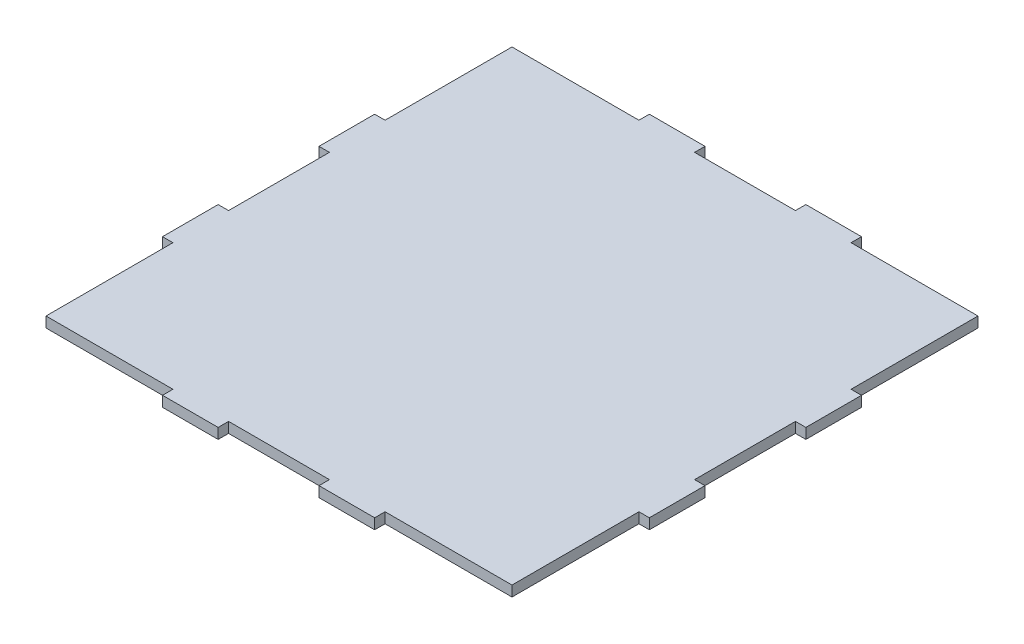
ISO-10303-21;
HEADER;
FILE_DESCRIPTION(('STEP AP214'),'2;1');
FILE_NAME('part.step','',(''),(''),'','','');
FILE_SCHEMA(('AUTOMOTIVE_DESIGN { 1 0 10303 214 1 1 1 1 }'));
ENDSEC;
DATA;
#1=APPLICATION_CONTEXT('core data for automotive mechanical design processes');
#2=APPLICATION_PROTOCOL_DEFINITION('international standard','automotive_design',2000,#1);
#3=PRODUCT_CONTEXT('',#1,'mechanical');
#4=PRODUCT('Part','Part','',(#3));
#5=PRODUCT_RELATED_PRODUCT_CATEGORY('part','',(#4));
#6=PRODUCT_DEFINITION_FORMATION('','',#4);
#7=PRODUCT_DEFINITION_CONTEXT('part definition',#1,'design');
#8=PRODUCT_DEFINITION('design','',#6,#7);
#9=PRODUCT_DEFINITION_SHAPE('','',#8);
#10=(LENGTH_UNIT() NAMED_UNIT(*) SI_UNIT(.MILLI.,.METRE.));
#11=(NAMED_UNIT(*) PLANE_ANGLE_UNIT() SI_UNIT($,.RADIAN.));
#12=(NAMED_UNIT(*) SI_UNIT($,.STERADIAN.) SOLID_ANGLE_UNIT());
#13=UNCERTAINTY_MEASURE_WITH_UNIT(LENGTH_MEASURE(1.E-05),#10,'distance_accuracy_value','');
#14=(GEOMETRIC_REPRESENTATION_CONTEXT(3) GLOBAL_UNCERTAINTY_ASSIGNED_CONTEXT((#13)) GLOBAL_UNIT_ASSIGNED_CONTEXT((#10,
#11,#12)) REPRESENTATION_CONTEXT('',''));
#15=CARTESIAN_POINT('',(0.,0.,0.));
#16=DIRECTION('',(0.,0.,1.));
#17=DIRECTION('',(1.,0.,0.));
#18=AXIS2_PLACEMENT_3D('',#15,#16,#17);
#19=CARTESIAN_POINT('',(0.,3.,-70.));
#20=DIRECTION('',(0.,0.,-1.));
#21=DIRECTION('',(-1.,0.,0.));
#22=AXIS2_PLACEMENT_3D('',#19,#20,#21);
#23=PLANE('',#22);
#24=DIRECTION('',(0.,1.,0.));
#25=VECTOR('',#24,1.);
#26=CARTESIAN_POINT('',(14.5,0.,-70.));
#27=LINE('',#26,#25);
#28=CARTESIAN_POINT('',(14.5,0.,-70.));
#29=VERTEX_POINT('',#28);
#30=CARTESIAN_POINT('',(14.5,3.,-70.));
#31=VERTEX_POINT('',#30);
#32=EDGE_CURVE('E512',#29,#31,#27,.T.);
#33=ORIENTED_EDGE('',*,*,#32,.T.);
#34=DIRECTION('',(1.,0.,0.));
#35=VECTOR('',#34,1.);
#36=CARTESIAN_POINT('',(0.,3.,-70.));
#37=LINE('',#36,#35);
#38=CARTESIAN_POINT('',(30.5,3.,-70.));
#39=VERTEX_POINT('',#38);
#40=EDGE_CURVE('E704',#31,#39,#37,.T.);
#41=ORIENTED_EDGE('',*,*,#40,.T.);
#42=DIRECTION('',(0.,1.,0.));
#43=VECTOR('',#42,1.);
#44=CARTESIAN_POINT('',(30.5,0.,-70.));
#45=LINE('',#44,#43);
#46=CARTESIAN_POINT('',(30.5,0.,-70.));
#47=VERTEX_POINT('',#46);
#48=EDGE_CURVE('E624',#47,#39,#45,.T.);
#49=ORIENTED_EDGE('',*,*,#48,.F.);
#50=DIRECTION('',(1.,0.,0.));
#51=VECTOR('',#50,1.);
#52=CARTESIAN_POINT('',(0.,0.,-70.));
#53=LINE('',#52,#51);
#54=EDGE_CURVE('E703',#29,#47,#53,.T.);
#55=ORIENTED_EDGE('',*,*,#54,.F.);
#56=EDGE_LOOP('',(#33,#41,#49,#55));
#57=FACE_BOUND('',#56,.T.);
#58=ADVANCED_FACE('F137',(#57),#23,.T.);
#59=DIRECTION('',(0.,1.,0.));
#60=VECTOR('',#59,1.);
#61=CARTESIAN_POINT('',(-14.5,0.,-70.));
#62=LINE('',#61,#60);
#63=CARTESIAN_POINT('',(-14.5,0.,-70.));
#64=VERTEX_POINT('',#63);
#65=CARTESIAN_POINT('',(-14.5,3.,-70.));
#66=VERTEX_POINT('',#65);
#67=EDGE_CURVE('E516',#64,#66,#62,.T.);
#68=ORIENTED_EDGE('',*,*,#67,.F.);
#69=CARTESIAN_POINT('',(-30.5,0.,-70.));
#70=VERTEX_POINT('',#69);
#71=EDGE_CURVE('E724',#70,#64,#53,.T.);
#72=ORIENTED_EDGE('',*,*,#71,.F.);
#73=DIRECTION('',(0.,1.,0.));
#74=VECTOR('',#73,1.);
#75=CARTESIAN_POINT('',(-30.5,0.,-70.));
#76=LINE('',#75,#74);
#77=CARTESIAN_POINT('',(-30.5,3.,-70.));
#78=VERTEX_POINT('',#77);
#79=EDGE_CURVE('E469',#70,#78,#76,.T.);
#80=ORIENTED_EDGE('',*,*,#79,.T.);
#81=EDGE_CURVE('E708',#78,#66,#37,.T.);
#82=ORIENTED_EDGE('',*,*,#81,.T.);
#83=EDGE_LOOP('',(#68,#72,#80,#82));
#84=FACE_BOUND('',#83,.T.);
#85=ADVANCED_FACE('F832',(#84),#23,.T.);
#86=CARTESIAN_POINT('',(-70.,3.,0.));
#87=DIRECTION('',(1.,0.,0.));
#88=DIRECTION('',(0.,0.,-1.));
#89=AXIS2_PLACEMENT_3D('',#86,#87,#88);
#90=PLANE('',#89);
#91=DIRECTION('',(0.,1.,0.));
#92=VECTOR('',#91,1.);
#93=CARTESIAN_POINT('',(-70.,0.,14.5));
#94=LINE('',#93,#92);
#95=CARTESIAN_POINT('',(-70.,0.,14.5));
#96=VERTEX_POINT('',#95);
#97=CARTESIAN_POINT('',(-70.,3.,14.5));
#98=VERTEX_POINT('',#97);
#99=EDGE_CURVE('E430',#96,#98,#94,.T.);
#100=ORIENTED_EDGE('',*,*,#99,.F.);
#101=DIRECTION('',(0.,0.,1.));
#102=VECTOR('',#101,1.);
#103=CARTESIAN_POINT('',(-70.,0.,0.));
#104=LINE('',#103,#102);
#105=CARTESIAN_POINT('',(-70.,0.,30.5));
#106=VERTEX_POINT('',#105);
#107=EDGE_CURVE('E725',#96,#106,#104,.T.);
#108=ORIENTED_EDGE('',*,*,#107,.T.);
#109=DIRECTION('',(0.,1.,0.));
#110=VECTOR('',#109,1.);
#111=CARTESIAN_POINT('',(-70.,0.,30.5));
#112=LINE('',#111,#110);
#113=CARTESIAN_POINT('',(-70.,3.,30.5));
#114=VERTEX_POINT('',#113);
#115=EDGE_CURVE('E678',#106,#114,#112,.T.);
#116=ORIENTED_EDGE('',*,*,#115,.T.);
#117=DIRECTION('',(0.,0.,1.));
#118=VECTOR('',#117,1.);
#119=CARTESIAN_POINT('',(-70.,3.,0.));
#120=LINE('',#119,#118);
#121=EDGE_CURVE('E710',#98,#114,#120,.T.);
#122=ORIENTED_EDGE('',*,*,#121,.F.);
#123=EDGE_LOOP('',(#100,#108,#116,#122));
#124=FACE_BOUND('',#123,.T.);
#125=ADVANCED_FACE('F815',(#124),#90,.F.);
#126=DIRECTION('',(0.,1.,0.));
#127=VECTOR('',#126,1.);
#128=CARTESIAN_POINT('',(-70.,0.,-14.5));
#129=LINE('',#128,#127);
#130=CARTESIAN_POINT('',(-70.,0.,-14.5));
#131=VERTEX_POINT('',#130);
#132=CARTESIAN_POINT('',(-70.,3.,-14.5));
#133=VERTEX_POINT('',#132);
#134=EDGE_CURVE('E433',#131,#133,#129,.T.);
#135=ORIENTED_EDGE('',*,*,#134,.T.);
#136=CARTESIAN_POINT('',(-70.,3.,-30.5));
#137=VERTEX_POINT('',#136);
#138=EDGE_CURVE('E714',#137,#133,#120,.T.);
#139=ORIENTED_EDGE('',*,*,#138,.F.);
#140=DIRECTION('',(0.,1.,0.));
#141=VECTOR('',#140,1.);
#142=CARTESIAN_POINT('',(-70.,0.,-30.5));
#143=LINE('',#142,#141);
#144=CARTESIAN_POINT('',(-70.,0.,-30.5));
#145=VERTEX_POINT('',#144);
#146=EDGE_CURVE('E470',#145,#137,#143,.T.);
#147=ORIENTED_EDGE('',*,*,#146,.F.);
#148=EDGE_CURVE('E728',#145,#131,#104,.T.);
#149=ORIENTED_EDGE('',*,*,#148,.T.);
#150=EDGE_LOOP('',(#135,#139,#147,#149));
#151=FACE_BOUND('',#150,.T.);
#152=ADVANCED_FACE('F743',(#151),#90,.F.);
#153=CARTESIAN_POINT('',(0.,3.,70.));
#154=DIRECTION('',(0.,0.,-1.));
#155=DIRECTION('',(-1.,0.,0.));
#156=AXIS2_PLACEMENT_3D('',#153,#154,#155);
#157=PLANE('',#156);
#158=DIRECTION('',(0.,1.,0.));
#159=VECTOR('',#158,1.);
#160=CARTESIAN_POINT('',(-14.5,0.,70.));
#161=LINE('',#160,#159);
#162=CARTESIAN_POINT('',(-14.5,0.,70.));
#163=VERTEX_POINT('',#162);
#164=CARTESIAN_POINT('',(-14.5,3.,70.));
#165=VERTEX_POINT('',#164);
#166=EDGE_CURVE('E591',#163,#165,#161,.T.);
#167=ORIENTED_EDGE('',*,*,#166,.T.);
#168=DIRECTION('',(1.,0.,0.));
#169=VECTOR('',#168,1.);
#170=CARTESIAN_POINT('',(0.,3.,70.));
#171=LINE('',#170,#169);
#172=CARTESIAN_POINT('',(-30.5,3.,70.));
#173=VERTEX_POINT('',#172);
#174=EDGE_CURVE('E718',#173,#165,#171,.T.);
#175=ORIENTED_EDGE('',*,*,#174,.F.);
#176=DIRECTION('',(0.,1.,0.));
#177=VECTOR('',#176,1.);
#178=CARTESIAN_POINT('',(-30.5,0.,70.));
#179=LINE('',#178,#177);
#180=CARTESIAN_POINT('',(-30.5,0.,70.));
#181=VERTEX_POINT('',#180);
#182=EDGE_CURVE('E690',#181,#173,#179,.T.);
#183=ORIENTED_EDGE('',*,*,#182,.F.);
#184=DIRECTION('',(1.,0.,0.));
#185=VECTOR('',#184,1.);
#186=CARTESIAN_POINT('',(0.,0.,70.));
#187=LINE('',#186,#185);
#188=EDGE_CURVE('E732',#181,#163,#187,.T.);
#189=ORIENTED_EDGE('',*,*,#188,.T.);
#190=EDGE_LOOP('',(#167,#175,#183,#189));
#191=FACE_BOUND('',#190,.T.);
#192=ADVANCED_FACE('F795',(#191),#157,.F.);
#193=DIRECTION('',(0.,1.,0.));
#194=VECTOR('',#193,1.);
#195=CARTESIAN_POINT('',(14.5,0.,70.));
#196=LINE('',#195,#194);
#197=CARTESIAN_POINT('',(14.5,0.,70.));
#198=VERTEX_POINT('',#197);
#199=CARTESIAN_POINT('',(14.5,3.,70.));
#200=VERTEX_POINT('',#199);
#201=EDGE_CURVE('E588',#198,#200,#196,.T.);
#202=ORIENTED_EDGE('',*,*,#201,.F.);
#203=CARTESIAN_POINT('',(30.5,0.,70.));
#204=VERTEX_POINT('',#203);
#205=EDGE_CURVE('E729',#198,#204,#187,.T.);
#206=ORIENTED_EDGE('',*,*,#205,.T.);
#207=DIRECTION('',(0.,1.,0.));
#208=VECTOR('',#207,1.);
#209=CARTESIAN_POINT('',(30.5,0.,70.));
#210=LINE('',#209,#208);
#211=CARTESIAN_POINT('',(30.5,3.,70.));
#212=VERTEX_POINT('',#211);
#213=EDGE_CURVE('E413',#204,#212,#210,.T.);
#214=ORIENTED_EDGE('',*,*,#213,.T.);
#215=EDGE_CURVE('E715',#200,#212,#171,.T.);
#216=ORIENTED_EDGE('',*,*,#215,.F.);
#217=EDGE_LOOP('',(#202,#206,#214,#216));
#218=FACE_BOUND('',#217,.T.);
#219=ADVANCED_FACE('F778',(#218),#157,.F.);
#220=CARTESIAN_POINT('',(70.,3.,0.));
#221=DIRECTION('',(1.,0.,0.));
#222=DIRECTION('',(0.,0.,-1.));
#223=AXIS2_PLACEMENT_3D('',#220,#221,#222);
#224=PLANE('',#223);
#225=DIRECTION('',(0.,1.,0.));
#226=VECTOR('',#225,1.);
#227=CARTESIAN_POINT('',(70.,0.,-14.5));
#228=LINE('',#227,#226);
#229=CARTESIAN_POINT('',(70.,0.,-14.5));
#230=VERTEX_POINT('',#229);
#231=CARTESIAN_POINT('',(70.,3.,-14.5));
#232=VERTEX_POINT('',#231);
#233=EDGE_CURVE('E394',#230,#232,#228,.T.);
#234=ORIENTED_EDGE('',*,*,#233,.F.);
#235=DIRECTION('',(0.,0.,1.));
#236=VECTOR('',#235,1.);
#237=CARTESIAN_POINT('',(70.,0.,0.));
#238=LINE('',#237,#236);
#239=CARTESIAN_POINT('',(70.,0.,-30.5));
#240=VERTEX_POINT('',#239);
#241=EDGE_CURVE('E709',#240,#230,#238,.T.);
#242=ORIENTED_EDGE('',*,*,#241,.F.);
#243=DIRECTION('',(0.,1.,0.));
#244=VECTOR('',#243,1.);
#245=CARTESIAN_POINT('',(70.,0.,-30.5));
#246=LINE('',#245,#244);
#247=CARTESIAN_POINT('',(70.,3.,-30.5));
#248=VERTEX_POINT('',#247);
#249=EDGE_CURVE('E620',#240,#248,#246,.T.);
#250=ORIENTED_EDGE('',*,*,#249,.T.);
#251=DIRECTION('',(0.,0.,1.));
#252=VECTOR('',#251,1.);
#253=CARTESIAN_POINT('',(70.,3.,0.));
#254=LINE('',#253,#252);
#255=EDGE_CURVE('E12',#248,#232,#254,.T.);
#256=ORIENTED_EDGE('',*,*,#255,.T.);
#257=EDGE_LOOP('',(#234,#242,#250,#256));
#258=FACE_BOUND('',#257,.T.);
#259=ADVANCED_FACE('F937',(#258),#224,.T.);
#260=DIRECTION('',(0.,1.,0.));
#261=VECTOR('',#260,1.);
#262=CARTESIAN_POINT('',(70.,0.,14.5));
#263=LINE('',#262,#261);
#264=CARTESIAN_POINT('',(70.,0.,14.5));
#265=VERTEX_POINT('',#264);
#266=CARTESIAN_POINT('',(70.,3.,14.5));
#267=VERTEX_POINT('',#266);
#268=EDGE_CURVE('E554',#265,#267,#263,.T.);
#269=ORIENTED_EDGE('',*,*,#268,.T.);
#270=CARTESIAN_POINT('',(70.,3.,30.5));
#271=VERTEX_POINT('',#270);
#272=EDGE_CURVE('E146',#267,#271,#254,.T.);
#273=ORIENTED_EDGE('',*,*,#272,.T.);
#274=DIRECTION('',(0.,1.,0.));
#275=VECTOR('',#274,1.);
#276=CARTESIAN_POINT('',(70.,0.,30.5));
#277=LINE('',#276,#275);
#278=CARTESIAN_POINT('',(70.,0.,30.5));
#279=VERTEX_POINT('',#278);
#280=EDGE_CURVE('E383',#279,#271,#277,.T.);
#281=ORIENTED_EDGE('',*,*,#280,.F.);
#282=EDGE_CURVE('E140',#265,#279,#238,.T.);
#283=ORIENTED_EDGE('',*,*,#282,.F.);
#284=EDGE_LOOP('',(#269,#273,#281,#283));
#285=FACE_BOUND('',#284,.T.);
#286=ADVANCED_FACE('F766',(#285),#224,.T.);
#287=CARTESIAN_POINT('',(0.,3.,0.));
#288=DIRECTION('',(0.,1.,0.));
#289=DIRECTION('',(0.,0.,1.));
#290=AXIS2_PLACEMENT_3D('',#287,#288,#289);
#291=PLANE('',#290);
#292=DIRECTION('',(-1.,0.,0.));
#293=VECTOR('',#292,1.);
#294=CARTESIAN_POINT('',(70.,3.,-14.5));
#295=LINE('',#294,#293);
#296=CARTESIAN_POINT('',(67.,3.,-14.5));
#297=VERTEX_POINT('',#296);
#298=EDGE_CURVE('E525',#232,#297,#295,.T.);
#299=ORIENTED_EDGE('',*,*,#298,.F.);
#300=ORIENTED_EDGE('',*,*,#255,.F.);
#301=DIRECTION('',(-1.,0.,0.));
#302=VECTOR('',#301,1.);
#303=CARTESIAN_POINT('',(70.,3.,-30.5));
#304=LINE('',#303,#302);
#305=CARTESIAN_POINT('',(67.,3.,-30.5));
#306=VERTEX_POINT('',#305);
#307=EDGE_CURVE('E625',#248,#306,#304,.T.);
#308=ORIENTED_EDGE('',*,*,#307,.T.);
#309=DIRECTION('',(0.,0.,-1.));
#310=VECTOR('',#309,1.);
#311=CARTESIAN_POINT('',(67.,3.,-30.5));
#312=LINE('',#311,#310);
#313=CARTESIAN_POINT('',(67.,3.,-67.));
#314=VERTEX_POINT('',#313);
#315=EDGE_CURVE('E648',#306,#314,#312,.T.);
#316=ORIENTED_EDGE('',*,*,#315,.T.);
#317=DIRECTION('',(-1.,0.,0.));
#318=VECTOR('',#317,1.);
#319=CARTESIAN_POINT('',(70.,3.,-67.));
#320=LINE('',#319,#318);
#321=CARTESIAN_POINT('',(30.5,3.,-67.));
#322=VERTEX_POINT('',#321);
#323=EDGE_CURVE('E585',#314,#322,#320,.T.);
#324=ORIENTED_EDGE('',*,*,#323,.T.);
#325=DIRECTION('',(0.,0.,-1.));
#326=VECTOR('',#325,1.);
#327=CARTESIAN_POINT('',(30.5,3.,-67.));
#328=LINE('',#327,#326);
#329=EDGE_CURVE('E629',#322,#39,#328,.T.);
#330=ORIENTED_EDGE('',*,*,#329,.T.);
#331=ORIENTED_EDGE('',*,*,#40,.F.);
#332=DIRECTION('',(0.,0.,-1.));
#333=VECTOR('',#332,1.);
#334=CARTESIAN_POINT('',(14.5,3.,-67.));
#335=LINE('',#334,#333);
#336=CARTESIAN_POINT('',(14.5,3.,-67.));
#337=VERTEX_POINT('',#336);
#338=EDGE_CURVE('E535',#337,#31,#335,.T.);
#339=ORIENTED_EDGE('',*,*,#338,.F.);
#340=DIRECTION('',(1.,0.,0.));
#341=VECTOR('',#340,1.);
#342=CARTESIAN_POINT('',(-14.5,3.,-67.));
#343=LINE('',#342,#341);
#344=CARTESIAN_POINT('',(-14.5,3.,-67.));
#345=VERTEX_POINT('',#344);
#346=EDGE_CURVE('E526',#345,#337,#343,.T.);
#347=ORIENTED_EDGE('',*,*,#346,.F.);
#348=DIRECTION('',(0.,0.,1.));
#349=VECTOR('',#348,1.);
#350=CARTESIAN_POINT('',(-14.5,3.,-70.));
#351=LINE('',#350,#349);
#352=EDGE_CURVE('E530',#66,#345,#351,.T.);
#353=ORIENTED_EDGE('',*,*,#352,.F.);
#354=ORIENTED_EDGE('',*,*,#81,.F.);
#355=DIRECTION('',(0.,0.,-1.));
#356=VECTOR('',#355,1.);
#357=CARTESIAN_POINT('',(-30.5,3.,-67.));
#358=LINE('',#357,#356);
#359=CARTESIAN_POINT('',(-30.5,3.,-67.));
#360=VERTEX_POINT('',#359);
#361=EDGE_CURVE('E500',#360,#78,#358,.T.);
#362=ORIENTED_EDGE('',*,*,#361,.F.);
#363=DIRECTION('',(1.,0.,0.));
#364=VECTOR('',#363,1.);
#365=CARTESIAN_POINT('',(-70.,3.,-67.));
#366=LINE('',#365,#364);
#367=CARTESIAN_POINT('',(-67.,3.,-67.));
#368=VERTEX_POINT('',#367);
#369=EDGE_CURVE('E477',#368,#360,#366,.T.);
#370=ORIENTED_EDGE('',*,*,#369,.F.);
#371=DIRECTION('',(0.,0.,-1.));
#372=VECTOR('',#371,1.);
#373=CARTESIAN_POINT('',(-67.,3.,-30.5));
#374=LINE('',#373,#372);
#375=CARTESIAN_POINT('',(-67.,3.,-30.5));
#376=VERTEX_POINT('',#375);
#377=EDGE_CURVE('E478',#376,#368,#374,.T.);
#378=ORIENTED_EDGE('',*,*,#377,.F.);
#379=DIRECTION('',(1.,0.,0.));
#380=VECTOR('',#379,1.);
#381=CARTESIAN_POINT('',(-70.,3.,-30.5));
#382=LINE('',#381,#380);
#383=EDGE_CURVE('E434',#137,#376,#382,.T.);
#384=ORIENTED_EDGE('',*,*,#383,.F.);
#385=ORIENTED_EDGE('',*,*,#138,.T.);
#386=DIRECTION('',(1.,0.,0.));
#387=VECTOR('',#386,1.);
#388=CARTESIAN_POINT('',(-70.,3.,-14.5));
#389=LINE('',#388,#387);
#390=CARTESIAN_POINT('',(-67.,3.,-14.5));
#391=VERTEX_POINT('',#390);
#392=EDGE_CURVE('E449',#133,#391,#389,.T.);
#393=ORIENTED_EDGE('',*,*,#392,.T.);
#394=DIRECTION('',(0.,0.,1.));
#395=VECTOR('',#394,1.);
#396=CARTESIAN_POINT('',(-67.,3.,-14.5));
#397=LINE('',#396,#395);
#398=CARTESIAN_POINT('',(-67.,3.,14.5));
#399=VERTEX_POINT('',#398);
#400=EDGE_CURVE('E445',#391,#399,#397,.T.);
#401=ORIENTED_EDGE('',*,*,#400,.T.);
#402=DIRECTION('',(-1.,0.,0.));
#403=VECTOR('',#402,1.);
#404=CARTESIAN_POINT('',(-67.,3.,14.5));
#405=LINE('',#404,#403);
#406=EDGE_CURVE('E454',#399,#98,#405,.T.);
#407=ORIENTED_EDGE('',*,*,#406,.T.);
#408=ORIENTED_EDGE('',*,*,#121,.T.);
#409=DIRECTION('',(1.,0.,0.));
#410=VECTOR('',#409,1.);
#411=CARTESIAN_POINT('',(-70.,3.,30.5));
#412=LINE('',#411,#410);
#413=CARTESIAN_POINT('',(-67.,3.,30.5));
#414=VERTEX_POINT('',#413);
#415=EDGE_CURVE('E668',#114,#414,#412,.T.);
#416=ORIENTED_EDGE('',*,*,#415,.T.);
#417=DIRECTION('',(0.,0.,1.));
#418=VECTOR('',#417,1.);
#419=CARTESIAN_POINT('',(-67.,3.,30.5));
#420=LINE('',#419,#418);
#421=CARTESIAN_POINT('',(-67.,3.,67.));
#422=VERTEX_POINT('',#421);
#423=EDGE_CURVE('E664',#414,#422,#420,.T.);
#424=ORIENTED_EDGE('',*,*,#423,.T.);
#425=DIRECTION('',(1.,0.,0.));
#426=VECTOR('',#425,1.);
#427=CARTESIAN_POINT('',(-70.,3.,67.));
#428=LINE('',#427,#426);
#429=CARTESIAN_POINT('',(-30.5,3.,67.));
#430=VERTEX_POINT('',#429);
#431=EDGE_CURVE('E609',#422,#430,#428,.T.);
#432=ORIENTED_EDGE('',*,*,#431,.T.);
#433=DIRECTION('',(0.,0.,1.));
#434=VECTOR('',#433,1.);
#435=CARTESIAN_POINT('',(-30.5,3.,67.));
#436=LINE('',#435,#434);
#437=EDGE_CURVE('E687',#430,#173,#436,.T.);
#438=ORIENTED_EDGE('',*,*,#437,.T.);
#439=ORIENTED_EDGE('',*,*,#174,.T.);
#440=DIRECTION('',(0.,0.,-1.));
#441=VECTOR('',#440,1.);
#442=CARTESIAN_POINT('',(-14.5,3.,70.));
#443=LINE('',#442,#441);
#444=CARTESIAN_POINT('',(-14.5,3.,67.));
#445=VERTEX_POINT('',#444);
#446=EDGE_CURVE('E605',#165,#445,#443,.T.);
#447=ORIENTED_EDGE('',*,*,#446,.T.);
#448=DIRECTION('',(1.,0.,0.));
#449=VECTOR('',#448,1.);
#450=CARTESIAN_POINT('',(-14.5,3.,67.));
#451=LINE('',#450,#449);
#452=CARTESIAN_POINT('',(14.5,3.,67.));
#453=VERTEX_POINT('',#452);
#454=EDGE_CURVE('E600',#445,#453,#451,.T.);
#455=ORIENTED_EDGE('',*,*,#454,.T.);
#456=DIRECTION('',(0.,0.,1.));
#457=VECTOR('',#456,1.);
#458=CARTESIAN_POINT('',(14.5,3.,67.));
#459=LINE('',#458,#457);
#460=EDGE_CURVE('E596',#453,#200,#459,.T.);
#461=ORIENTED_EDGE('',*,*,#460,.T.);
#462=ORIENTED_EDGE('',*,*,#215,.T.);
#463=DIRECTION('',(0.,0.,1.));
#464=VECTOR('',#463,1.);
#465=CARTESIAN_POINT('',(30.5,3.,67.));
#466=LINE('',#465,#464);
#467=CARTESIAN_POINT('',(30.5,3.,67.));
#468=VERTEX_POINT('',#467);
#469=EDGE_CURVE('E418',#468,#212,#466,.T.);
#470=ORIENTED_EDGE('',*,*,#469,.F.);
#471=DIRECTION('',(-1.,0.,0.));
#472=VECTOR('',#471,1.);
#473=CARTESIAN_POINT('',(70.,3.,67.));
#474=LINE('',#473,#472);
#475=CARTESIAN_POINT('',(67.,3.,67.));
#476=VERTEX_POINT('',#475);
#477=EDGE_CURVE('E384',#476,#468,#474,.T.);
#478=ORIENTED_EDGE('',*,*,#477,.F.);
#479=DIRECTION('',(0.,0.,1.));
#480=VECTOR('',#479,1.);
#481=CARTESIAN_POINT('',(67.,3.,30.5));
#482=LINE('',#481,#480);
#483=CARTESIAN_POINT('',(67.,3.,30.5));
#484=VERTEX_POINT('',#483);
#485=EDGE_CURVE('E376',#484,#476,#482,.T.);
#486=ORIENTED_EDGE('',*,*,#485,.F.);
#487=DIRECTION('',(-1.,0.,0.));
#488=VECTOR('',#487,1.);
#489=CARTESIAN_POINT('',(70.,3.,30.5));
#490=LINE('',#489,#488);
#491=EDGE_CURVE('E387',#271,#484,#490,.T.);
#492=ORIENTED_EDGE('',*,*,#491,.F.);
#493=ORIENTED_EDGE('',*,*,#272,.F.);
#494=DIRECTION('',(1.,0.,0.));
#495=VECTOR('',#494,1.);
#496=CARTESIAN_POINT('',(67.,3.,14.5));
#497=LINE('',#496,#495);
#498=CARTESIAN_POINT('',(67.,3.,14.5));
#499=VERTEX_POINT('',#498);
#500=EDGE_CURVE('E560',#499,#267,#497,.T.);
#501=ORIENTED_EDGE('',*,*,#500,.F.);
#502=DIRECTION('',(0.,0.,1.));
#503=VECTOR('',#502,1.);
#504=CARTESIAN_POINT('',(67.,3.,-14.5));
#505=LINE('',#504,#503);
#506=EDGE_CURVE('E563',#297,#499,#505,.T.);
#507=ORIENTED_EDGE('',*,*,#506,.F.);
#508=EDGE_LOOP('',(#299,#300,#308,#316,#324,#330,#331,#339,#347,#353,#354,#362,#370,#378,#384,
#385,#393,#401,#407,#408,#416,#424,#432,#438,#439,#447,#455,#461,#462,#470,#478,#486,#492,#493,
#501,#507));
#509=FACE_BOUND('',#508,.T.);
#510=ADVANCED_FACE('F397',(#509),#291,.T.);
#511=CARTESIAN_POINT('',(0.,0.,0.));
#512=DIRECTION('',(0.,1.,0.));
#513=DIRECTION('',(0.,0.,1.));
#514=AXIS2_PLACEMENT_3D('',#511,#512,#513);
#515=PLANE('',#514);
#516=ORIENTED_EDGE('',*,*,#241,.T.);
#517=DIRECTION('',(-1.,0.,0.));
#518=VECTOR('',#517,1.);
#519=CARTESIAN_POINT('',(70.,0.,-14.5));
#520=LINE('',#519,#518);
#521=CARTESIAN_POINT('',(67.,0.,-14.5));
#522=VERTEX_POINT('',#521);
#523=EDGE_CURVE('E564',#230,#522,#520,.T.);
#524=ORIENTED_EDGE('',*,*,#523,.T.);
#525=DIRECTION('',(0.,0.,1.));
#526=VECTOR('',#525,1.);
#527=CARTESIAN_POINT('',(67.,0.,-14.5));
#528=LINE('',#527,#526);
#529=CARTESIAN_POINT('',(67.,0.,14.5));
#530=VERTEX_POINT('',#529);
#531=EDGE_CURVE('E573',#522,#530,#528,.T.);
#532=ORIENTED_EDGE('',*,*,#531,.T.);
#533=DIRECTION('',(1.,0.,0.));
#534=VECTOR('',#533,1.);
#535=CARTESIAN_POINT('',(67.,0.,14.5));
#536=LINE('',#535,#534);
#537=EDGE_CURVE('E154',#530,#265,#536,.T.);
#538=ORIENTED_EDGE('',*,*,#537,.T.);
#539=ORIENTED_EDGE('',*,*,#282,.T.);
#540=DIRECTION('',(-1.,0.,0.));
#541=VECTOR('',#540,1.);
#542=CARTESIAN_POINT('',(70.,0.,30.5));
#543=LINE('',#542,#541);
#544=CARTESIAN_POINT('',(67.,0.,30.5));
#545=VERTEX_POINT('',#544);
#546=EDGE_CURVE('E400',#279,#545,#543,.T.);
#547=ORIENTED_EDGE('',*,*,#546,.T.);
#548=DIRECTION('',(0.,0.,1.));
#549=VECTOR('',#548,1.);
#550=CARTESIAN_POINT('',(67.,0.,30.5));
#551=LINE('',#550,#549);
#552=CARTESIAN_POINT('',(67.,0.,67.));
#553=VERTEX_POINT('',#552);
#554=EDGE_CURVE('E379',#545,#553,#551,.T.);
#555=ORIENTED_EDGE('',*,*,#554,.T.);
#556=DIRECTION('',(-1.,0.,0.));
#557=VECTOR('',#556,1.);
#558=CARTESIAN_POINT('',(70.,0.,67.));
#559=LINE('',#558,#557);
#560=CARTESIAN_POINT('',(30.5,0.,67.));
#561=VERTEX_POINT('',#560);
#562=EDGE_CURVE('E421',#553,#561,#559,.T.);
#563=ORIENTED_EDGE('',*,*,#562,.T.);
#564=DIRECTION('',(0.,0.,1.));
#565=VECTOR('',#564,1.);
#566=CARTESIAN_POINT('',(30.5,0.,67.));
#567=LINE('',#566,#565);
#568=EDGE_CURVE('E412',#561,#204,#567,.T.);
#569=ORIENTED_EDGE('',*,*,#568,.T.);
#570=ORIENTED_EDGE('',*,*,#205,.F.);
#571=DIRECTION('',(0.,0.,1.));
#572=VECTOR('',#571,1.);
#573=CARTESIAN_POINT('',(14.5,0.,67.));
#574=LINE('',#573,#572);
#575=CARTESIAN_POINT('',(14.5,0.,67.));
#576=VERTEX_POINT('',#575);
#577=EDGE_CURVE('E595',#576,#198,#574,.T.);
#578=ORIENTED_EDGE('',*,*,#577,.F.);
#579=DIRECTION('',(1.,0.,0.));
#580=VECTOR('',#579,1.);
#581=CARTESIAN_POINT('',(-14.5,0.,67.));
#582=LINE('',#581,#580);
#583=CARTESIAN_POINT('',(-14.5,0.,67.));
#584=VERTEX_POINT('',#583);
#585=EDGE_CURVE('E612',#584,#576,#582,.T.);
#586=ORIENTED_EDGE('',*,*,#585,.F.);
#587=DIRECTION('',(0.,0.,-1.));
#588=VECTOR('',#587,1.);
#589=CARTESIAN_POINT('',(-14.5,0.,70.));
#590=LINE('',#589,#588);
#591=EDGE_CURVE('E601',#163,#584,#590,.T.);
#592=ORIENTED_EDGE('',*,*,#591,.F.);
#593=ORIENTED_EDGE('',*,*,#188,.F.);
#594=DIRECTION('',(0.,0.,1.));
#595=VECTOR('',#594,1.);
#596=CARTESIAN_POINT('',(-30.5,0.,67.));
#597=LINE('',#596,#595);
#598=CARTESIAN_POINT('',(-30.5,0.,67.));
#599=VERTEX_POINT('',#598);
#600=EDGE_CURVE('E686',#599,#181,#597,.T.);
#601=ORIENTED_EDGE('',*,*,#600,.F.);
#602=DIRECTION('',(1.,0.,0.));
#603=VECTOR('',#602,1.);
#604=CARTESIAN_POINT('',(-70.,0.,67.));
#605=LINE('',#604,#603);
#606=CARTESIAN_POINT('',(-67.,0.,67.));
#607=VERTEX_POINT('',#606);
#608=EDGE_CURVE('E683',#607,#599,#605,.T.);
#609=ORIENTED_EDGE('',*,*,#608,.F.);
#610=DIRECTION('',(0.,0.,1.));
#611=VECTOR('',#610,1.);
#612=CARTESIAN_POINT('',(-67.,0.,30.5));
#613=LINE('',#612,#611);
#614=CARTESIAN_POINT('',(-67.,0.,30.5));
#615=VERTEX_POINT('',#614);
#616=EDGE_CURVE('E663',#615,#607,#613,.T.);
#617=ORIENTED_EDGE('',*,*,#616,.F.);
#618=DIRECTION('',(1.,0.,0.));
#619=VECTOR('',#618,1.);
#620=CARTESIAN_POINT('',(-70.,0.,30.5));
#621=LINE('',#620,#619);
#622=EDGE_CURVE('E660',#106,#615,#621,.T.);
#623=ORIENTED_EDGE('',*,*,#622,.F.);
#624=ORIENTED_EDGE('',*,*,#107,.F.);
#625=DIRECTION('',(-1.,0.,0.));
#626=VECTOR('',#625,1.);
#627=CARTESIAN_POINT('',(-67.,0.,14.5));
#628=LINE('',#627,#626);
#629=CARTESIAN_POINT('',(-67.,0.,14.5));
#630=VERTEX_POINT('',#629);
#631=EDGE_CURVE('E450',#630,#96,#628,.T.);
#632=ORIENTED_EDGE('',*,*,#631,.F.);
#633=DIRECTION('',(0.,0.,1.));
#634=VECTOR('',#633,1.);
#635=CARTESIAN_POINT('',(-67.,0.,-14.5));
#636=LINE('',#635,#634);
#637=CARTESIAN_POINT('',(-67.,0.,-14.5));
#638=VERTEX_POINT('',#637);
#639=EDGE_CURVE('E444',#638,#630,#636,.T.);
#640=ORIENTED_EDGE('',*,*,#639,.F.);
#641=DIRECTION('',(1.,0.,0.));
#642=VECTOR('',#641,1.);
#643=CARTESIAN_POINT('',(-70.,0.,-14.5));
#644=LINE('',#643,#642);
#645=EDGE_CURVE('E460',#131,#638,#644,.T.);
#646=ORIENTED_EDGE('',*,*,#645,.F.);
#647=ORIENTED_EDGE('',*,*,#148,.F.);
#648=DIRECTION('',(1.,0.,0.));
#649=VECTOR('',#648,1.);
#650=CARTESIAN_POINT('',(-70.,0.,-30.5));
#651=LINE('',#650,#649);
#652=CARTESIAN_POINT('',(-67.,0.,-30.5));
#653=VERTEX_POINT('',#652);
#654=EDGE_CURVE('E482',#145,#653,#651,.T.);
#655=ORIENTED_EDGE('',*,*,#654,.T.);
#656=DIRECTION('',(0.,0.,-1.));
#657=VECTOR('',#656,1.);
#658=CARTESIAN_POINT('',(-67.,0.,-30.5));
#659=LINE('',#658,#657);
#660=CARTESIAN_POINT('',(-67.,0.,-67.));
#661=VERTEX_POINT('',#660);
#662=EDGE_CURVE('E473',#653,#661,#659,.T.);
#663=ORIENTED_EDGE('',*,*,#662,.T.);
#664=DIRECTION('',(1.,0.,0.));
#665=VECTOR('',#664,1.);
#666=CARTESIAN_POINT('',(-70.,0.,-67.));
#667=LINE('',#666,#665);
#668=CARTESIAN_POINT('',(-30.5,0.,-67.));
#669=VERTEX_POINT('',#668);
#670=EDGE_CURVE('E503',#661,#669,#667,.T.);
#671=ORIENTED_EDGE('',*,*,#670,.T.);
#672=DIRECTION('',(0.,0.,-1.));
#673=VECTOR('',#672,1.);
#674=CARTESIAN_POINT('',(-30.5,0.,-67.));
#675=LINE('',#674,#673);
#676=EDGE_CURVE('E496',#669,#70,#675,.T.);
#677=ORIENTED_EDGE('',*,*,#676,.T.);
#678=ORIENTED_EDGE('',*,*,#71,.T.);
#679=DIRECTION('',(0.,0.,1.));
#680=VECTOR('',#679,1.);
#681=CARTESIAN_POINT('',(-14.5,0.,-70.));
#682=LINE('',#681,#680);
#683=CARTESIAN_POINT('',(-14.5,0.,-67.));
#684=VERTEX_POINT('',#683);
#685=EDGE_CURVE('E541',#64,#684,#682,.T.);
#686=ORIENTED_EDGE('',*,*,#685,.T.);
#687=DIRECTION('',(1.,0.,0.));
#688=VECTOR('',#687,1.);
#689=CARTESIAN_POINT('',(-14.5,0.,-67.));
#690=LINE('',#689,#688);
#691=CARTESIAN_POINT('',(14.5,0.,-67.));
#692=VERTEX_POINT('',#691);
#693=EDGE_CURVE('E162',#684,#692,#690,.T.);
#694=ORIENTED_EDGE('',*,*,#693,.T.);
#695=DIRECTION('',(0.,0.,-1.));
#696=VECTOR('',#695,1.);
#697=CARTESIAN_POINT('',(14.5,0.,-67.));
#698=LINE('',#697,#696);
#699=EDGE_CURVE('E531',#692,#29,#698,.T.);
#700=ORIENTED_EDGE('',*,*,#699,.T.);
#701=ORIENTED_EDGE('',*,*,#54,.T.);
#702=DIRECTION('',(0.,0.,-1.));
#703=VECTOR('',#702,1.);
#704=CARTESIAN_POINT('',(30.5,0.,-67.));
#705=LINE('',#704,#703);
#706=CARTESIAN_POINT('',(30.5,0.,-67.));
#707=VERTEX_POINT('',#706);
#708=EDGE_CURVE('E628',#707,#47,#705,.T.);
#709=ORIENTED_EDGE('',*,*,#708,.F.);
#710=DIRECTION('',(-1.,0.,0.));
#711=VECTOR('',#710,1.);
#712=CARTESIAN_POINT('',(70.,0.,-67.));
#713=LINE('',#712,#711);
#714=CARTESIAN_POINT('',(67.,0.,-67.));
#715=VERTEX_POINT('',#714);
#716=EDGE_CURVE('E633',#715,#707,#713,.T.);
#717=ORIENTED_EDGE('',*,*,#716,.F.);
#718=DIRECTION('',(0.,0.,-1.));
#719=VECTOR('',#718,1.);
#720=CARTESIAN_POINT('',(67.,0.,-30.5));
#721=LINE('',#720,#719);
#722=CARTESIAN_POINT('',(67.,0.,-30.5));
#723=VERTEX_POINT('',#722);
#724=EDGE_CURVE('E647',#723,#715,#721,.T.);
#725=ORIENTED_EDGE('',*,*,#724,.F.);
#726=DIRECTION('',(-1.,0.,0.));
#727=VECTOR('',#726,1.);
#728=CARTESIAN_POINT('',(70.,0.,-30.5));
#729=LINE('',#728,#727);
#730=EDGE_CURVE('E652',#240,#723,#729,.T.);
#731=ORIENTED_EDGE('',*,*,#730,.F.);
#732=EDGE_LOOP('',(#516,#524,#532,#538,#539,#547,#555,#563,#569,#570,#578,#586,#592,#593,#601,
#609,#617,#623,#624,#632,#640,#646,#647,#655,#663,#671,#677,#678,#686,#694,#700,#701,#709,#717,
#725,#731));
#733=FACE_BOUND('',#732,.T.);
#734=ADVANCED_FACE('F749',(#733),#515,.F.);
#735=CARTESIAN_POINT('',(-70.,0.,30.5));
#736=DIRECTION('',(0.,0.,1.));
#737=DIRECTION('',(1.,0.,0.));
#738=AXIS2_PLACEMENT_3D('',#735,#736,#737);
#739=PLANE('',#738);
#740=ORIENTED_EDGE('',*,*,#415,.F.);
#741=ORIENTED_EDGE('',*,*,#115,.F.);
#742=ORIENTED_EDGE('',*,*,#622,.T.);
#743=DIRECTION('',(0.,1.,0.));
#744=VECTOR('',#743,1.);
#745=CARTESIAN_POINT('',(-67.,0.,30.5));
#746=LINE('',#745,#744);
#747=EDGE_CURVE('E667',#615,#414,#746,.T.);
#748=ORIENTED_EDGE('',*,*,#747,.T.);
#749=EDGE_LOOP('',(#740,#741,#742,#748));
#750=FACE_BOUND('',#749,.T.);
#751=ADVANCED_FACE('F821',(#750),#739,.T.);
#752=CARTESIAN_POINT('',(-67.,0.,30.5));
#753=DIRECTION('',(-1.,0.,0.));
#754=DIRECTION('',(0.,0.,1.));
#755=AXIS2_PLACEMENT_3D('',#752,#753,#754);
#756=PLANE('',#755);
#757=DIRECTION('',(0.,1.,0.));
#758=VECTOR('',#757,1.);
#759=CARTESIAN_POINT('',(-67.,0.,67.));
#760=LINE('',#759,#758);
#761=EDGE_CURVE('E682',#607,#422,#760,.T.);
#762=ORIENTED_EDGE('',*,*,#761,.T.);
#763=ORIENTED_EDGE('',*,*,#423,.F.);
#764=ORIENTED_EDGE('',*,*,#747,.F.);
#765=ORIENTED_EDGE('',*,*,#616,.T.);
#766=EDGE_LOOP('',(#762,#763,#764,#765));
#767=FACE_BOUND('',#766,.T.);
#768=ADVANCED_FACE('F808',(#767),#756,.T.);
#769=CARTESIAN_POINT('',(-30.5,0.,67.));
#770=DIRECTION('',(-1.,0.,0.));
#771=DIRECTION('',(0.,0.,1.));
#772=AXIS2_PLACEMENT_3D('',#769,#770,#771);
#773=PLANE('',#772);
#774=ORIENTED_EDGE('',*,*,#437,.F.);
#775=DIRECTION('',(0.,1.,0.));
#776=VECTOR('',#775,1.);
#777=CARTESIAN_POINT('',(-30.5,0.,67.));
#778=LINE('',#777,#776);
#779=EDGE_CURVE('E672',#599,#430,#778,.T.);
#780=ORIENTED_EDGE('',*,*,#779,.F.);
#781=ORIENTED_EDGE('',*,*,#600,.T.);
#782=ORIENTED_EDGE('',*,*,#182,.T.);
#783=EDGE_LOOP('',(#774,#780,#781,#782));
#784=FACE_BOUND('',#783,.T.);
#785=ADVANCED_FACE('F801',(#784),#773,.T.);
#786=CARTESIAN_POINT('',(-70.,0.,67.));
#787=DIRECTION('',(0.,0.,1.));
#788=DIRECTION('',(1.,0.,0.));
#789=AXIS2_PLACEMENT_3D('',#786,#787,#788);
#790=PLANE('',#789);
#791=ORIENTED_EDGE('',*,*,#608,.T.);
#792=ORIENTED_EDGE('',*,*,#779,.T.);
#793=ORIENTED_EDGE('',*,*,#431,.F.);
#794=ORIENTED_EDGE('',*,*,#761,.F.);
#795=EDGE_LOOP('',(#791,#792,#793,#794));
#796=FACE_BOUND('',#795,.T.);
#797=ADVANCED_FACE('F804',(#796),#790,.T.);
#798=CARTESIAN_POINT('',(-30.5,0.,-67.));
#799=DIRECTION('',(1.,0.,0.));
#800=DIRECTION('',(0.,0.,-1.));
#801=AXIS2_PLACEMENT_3D('',#798,#799,#800);
#802=PLANE('',#801);
#803=ORIENTED_EDGE('',*,*,#361,.T.);
#804=ORIENTED_EDGE('',*,*,#79,.F.);
#805=ORIENTED_EDGE('',*,*,#676,.F.);
#806=DIRECTION('',(0.,1.,0.));
#807=VECTOR('',#806,1.);
#808=CARTESIAN_POINT('',(-30.5,0.,-67.));
#809=LINE('',#808,#807);
#810=EDGE_CURVE('E492',#669,#360,#809,.T.);
#811=ORIENTED_EDGE('',*,*,#810,.T.);
#812=EDGE_LOOP('',(#803,#804,#805,#811));
#813=FACE_BOUND('',#812,.T.);
#814=ADVANCED_FACE('F863',(#813),#802,.F.);
#815=CARTESIAN_POINT('',(-70.,0.,-67.));
#816=DIRECTION('',(0.,0.,1.));
#817=DIRECTION('',(1.,0.,0.));
#818=AXIS2_PLACEMENT_3D('',#815,#816,#817);
#819=PLANE('',#818);
#820=DIRECTION('',(0.,1.,0.));
#821=VECTOR('',#820,1.);
#822=CARTESIAN_POINT('',(-67.,0.,-67.));
#823=LINE('',#822,#821);
#824=EDGE_CURVE('E466',#661,#368,#823,.T.);
#825=ORIENTED_EDGE('',*,*,#824,.T.);
#826=ORIENTED_EDGE('',*,*,#369,.T.);
#827=ORIENTED_EDGE('',*,*,#810,.F.);
#828=ORIENTED_EDGE('',*,*,#670,.F.);
#829=EDGE_LOOP('',(#825,#826,#827,#828));
#830=FACE_BOUND('',#829,.T.);
#831=ADVANCED_FACE('F866',(#830),#819,.F.);
#832=CARTESIAN_POINT('',(-67.,0.,-30.5));
#833=DIRECTION('',(1.,0.,0.));
#834=DIRECTION('',(0.,0.,-1.));
#835=AXIS2_PLACEMENT_3D('',#832,#833,#834);
#836=PLANE('',#835);
#837=ORIENTED_EDGE('',*,*,#662,.F.);
#838=DIRECTION('',(0.,1.,0.));
#839=VECTOR('',#838,1.);
#840=CARTESIAN_POINT('',(-67.,0.,-30.5));
#841=LINE('',#840,#839);
#842=EDGE_CURVE('E474',#653,#376,#841,.T.);
#843=ORIENTED_EDGE('',*,*,#842,.T.);
#844=ORIENTED_EDGE('',*,*,#377,.T.);
#845=ORIENTED_EDGE('',*,*,#824,.F.);
#846=EDGE_LOOP('',(#837,#843,#844,#845));
#847=FACE_BOUND('',#846,.T.);
#848=ADVANCED_FACE('F869',(#847),#836,.F.);
#849=CARTESIAN_POINT('',(-70.,0.,-30.5));
#850=DIRECTION('',(0.,0.,1.));
#851=DIRECTION('',(1.,0.,0.));
#852=AXIS2_PLACEMENT_3D('',#849,#850,#851);
#853=PLANE('',#852);
#854=ORIENTED_EDGE('',*,*,#383,.T.);
#855=ORIENTED_EDGE('',*,*,#842,.F.);
#856=ORIENTED_EDGE('',*,*,#654,.F.);
#857=ORIENTED_EDGE('',*,*,#146,.T.);
#858=EDGE_LOOP('',(#854,#855,#856,#857));
#859=FACE_BOUND('',#858,.T.);
#860=ADVANCED_FACE('F872',(#859),#853,.F.);
#861=CARTESIAN_POINT('',(-67.,0.,14.5));
#862=DIRECTION('',(0.,0.,-1.));
#863=DIRECTION('',(-1.,0.,0.));
#864=AXIS2_PLACEMENT_3D('',#861,#862,#863);
#865=PLANE('',#864);
#866=ORIENTED_EDGE('',*,*,#406,.F.);
#867=DIRECTION('',(0.,1.,0.));
#868=VECTOR('',#867,1.);
#869=CARTESIAN_POINT('',(-67.,0.,14.5));
#870=LINE('',#869,#868);
#871=EDGE_CURVE('E441',#630,#399,#870,.T.);
#872=ORIENTED_EDGE('',*,*,#871,.F.);
#873=ORIENTED_EDGE('',*,*,#631,.T.);
#874=ORIENTED_EDGE('',*,*,#99,.T.);
#875=EDGE_LOOP('',(#866,#872,#873,#874));
#876=FACE_BOUND('',#875,.T.);
#877=ADVANCED_FACE('F819',(#876),#865,.T.);
#878=CARTESIAN_POINT('',(-70.,0.,-14.5));
#879=DIRECTION('',(0.,0.,1.));
#880=DIRECTION('',(1.,0.,0.));
#881=AXIS2_PLACEMENT_3D('',#878,#879,#880);
#882=PLANE('',#881);
#883=ORIENTED_EDGE('',*,*,#392,.F.);
#884=ORIENTED_EDGE('',*,*,#134,.F.);
#885=ORIENTED_EDGE('',*,*,#645,.T.);
#886=DIRECTION('',(0.,1.,0.));
#887=VECTOR('',#886,1.);
#888=CARTESIAN_POINT('',(-67.,0.,-14.5));
#889=LINE('',#888,#887);
#890=EDGE_CURVE('E438',#638,#391,#889,.T.);
#891=ORIENTED_EDGE('',*,*,#890,.T.);
#892=EDGE_LOOP('',(#883,#884,#885,#891));
#893=FACE_BOUND('',#892,.T.);
#894=ADVANCED_FACE('F753',(#893),#882,.T.);
#895=CARTESIAN_POINT('',(-67.,0.,-14.5));
#896=DIRECTION('',(-1.,0.,0.));
#897=DIRECTION('',(0.,0.,1.));
#898=AXIS2_PLACEMENT_3D('',#895,#896,#897);
#899=PLANE('',#898);
#900=ORIENTED_EDGE('',*,*,#400,.F.);
#901=ORIENTED_EDGE('',*,*,#890,.F.);
#902=ORIENTED_EDGE('',*,*,#639,.T.);
#903=ORIENTED_EDGE('',*,*,#871,.T.);
#904=EDGE_LOOP('',(#900,#901,#902,#903));
#905=FACE_BOUND('',#904,.T.);
#906=ADVANCED_FACE('F882',(#905),#899,.T.);
#907=CARTESIAN_POINT('',(30.5,0.,67.));
#908=DIRECTION('',(-1.,0.,0.));
#909=DIRECTION('',(0.,0.,1.));
#910=AXIS2_PLACEMENT_3D('',#907,#908,#909);
#911=PLANE('',#910);
#912=ORIENTED_EDGE('',*,*,#469,.T.);
#913=ORIENTED_EDGE('',*,*,#213,.F.);
#914=ORIENTED_EDGE('',*,*,#568,.F.);
#915=DIRECTION('',(0.,1.,0.));
#916=VECTOR('',#915,1.);
#917=CARTESIAN_POINT('',(30.5,0.,67.));
#918=LINE('',#917,#916);
#919=EDGE_CURVE('E408',#561,#468,#918,.T.);
#920=ORIENTED_EDGE('',*,*,#919,.T.);
#921=EDGE_LOOP('',(#912,#913,#914,#920));
#922=FACE_BOUND('',#921,.T.);
#923=ADVANCED_FACE('F776',(#922),#911,.F.);
#924=CARTESIAN_POINT('',(70.,0.,67.));
#925=DIRECTION('',(0.,0.,-1.));
#926=DIRECTION('',(-1.,0.,0.));
#927=AXIS2_PLACEMENT_3D('',#924,#925,#926);
#928=PLANE('',#927);
#929=DIRECTION('',(0.,1.,0.));
#930=VECTOR('',#929,1.);
#931=CARTESIAN_POINT('',(67.,0.,67.));
#932=LINE('',#931,#930);
#933=EDGE_CURVE('E417',#553,#476,#932,.T.);
#934=ORIENTED_EDGE('',*,*,#933,.T.);
#935=ORIENTED_EDGE('',*,*,#477,.T.);
#936=ORIENTED_EDGE('',*,*,#919,.F.);
#937=ORIENTED_EDGE('',*,*,#562,.F.);
#938=EDGE_LOOP('',(#934,#935,#936,#937));
#939=FACE_BOUND('',#938,.T.);
#940=ADVANCED_FACE('F772',(#939),#928,.F.);
#941=CARTESIAN_POINT('',(67.,0.,30.5));
#942=DIRECTION('',(-1.,0.,0.));
#943=DIRECTION('',(0.,0.,1.));
#944=AXIS2_PLACEMENT_3D('',#941,#942,#943);
#945=PLANE('',#944);
#946=ORIENTED_EDGE('',*,*,#554,.F.);
#947=DIRECTION('',(0.,1.,0.));
#948=VECTOR('',#947,1.);
#949=CARTESIAN_POINT('',(67.,0.,30.5));
#950=LINE('',#949,#948);
#951=EDGE_CURVE('E372',#545,#484,#950,.T.);
#952=ORIENTED_EDGE('',*,*,#951,.T.);
#953=ORIENTED_EDGE('',*,*,#485,.T.);
#954=ORIENTED_EDGE('',*,*,#933,.F.);
#955=EDGE_LOOP('',(#946,#952,#953,#954));
#956=FACE_BOUND('',#955,.T.);
#957=ADVANCED_FACE('F374',(#956),#945,.F.);
#958=CARTESIAN_POINT('',(70.,0.,30.5));
#959=DIRECTION('',(0.,0.,-1.));
#960=DIRECTION('',(-1.,0.,0.));
#961=AXIS2_PLACEMENT_3D('',#958,#959,#960);
#962=PLANE('',#961);
#963=ORIENTED_EDGE('',*,*,#491,.T.);
#964=ORIENTED_EDGE('',*,*,#951,.F.);
#965=ORIENTED_EDGE('',*,*,#546,.F.);
#966=ORIENTED_EDGE('',*,*,#280,.T.);
#967=EDGE_LOOP('',(#963,#964,#965,#966));
#968=FACE_BOUND('',#967,.T.);
#969=ADVANCED_FACE('F388',(#968),#962,.F.);
#970=CARTESIAN_POINT('',(-14.5,0.,70.));
#971=DIRECTION('',(1.,0.,0.));
#972=DIRECTION('',(0.,0.,-1.));
#973=AXIS2_PLACEMENT_3D('',#970,#971,#972);
#974=PLANE('',#973);
#975=ORIENTED_EDGE('',*,*,#446,.F.);
#976=ORIENTED_EDGE('',*,*,#166,.F.);
#977=ORIENTED_EDGE('',*,*,#591,.T.);
#978=DIRECTION('',(0.,1.,0.));
#979=VECTOR('',#978,1.);
#980=CARTESIAN_POINT('',(-14.5,0.,67.));
#981=LINE('',#980,#979);
#982=EDGE_CURVE('E580',#584,#445,#981,.T.);
#983=ORIENTED_EDGE('',*,*,#982,.T.);
#984=EDGE_LOOP('',(#975,#976,#977,#983));
#985=FACE_BOUND('',#984,.T.);
#986=ADVANCED_FACE('F789',(#985),#974,.T.);
#987=CARTESIAN_POINT('',(-14.5,0.,67.));
#988=DIRECTION('',(0.,0.,1.));
#989=DIRECTION('',(1.,0.,0.));
#990=AXIS2_PLACEMENT_3D('',#987,#988,#989);
#991=PLANE('',#990);
#992=ORIENTED_EDGE('',*,*,#454,.F.);
#993=ORIENTED_EDGE('',*,*,#982,.F.);
#994=ORIENTED_EDGE('',*,*,#585,.T.);
#995=DIRECTION('',(0.,1.,0.));
#996=VECTOR('',#995,1.);
#997=CARTESIAN_POINT('',(14.5,0.,67.));
#998=LINE('',#997,#996);
#999=EDGE_CURVE('E584',#576,#453,#998,.T.);
#1000=ORIENTED_EDGE('',*,*,#999,.T.);
#1001=EDGE_LOOP('',(#992,#993,#994,#1000));
#1002=FACE_BOUND('',#1001,.T.);
#1003=ADVANCED_FACE('F787',(#1002),#991,.T.);
#1004=CARTESIAN_POINT('',(14.5,0.,67.));
#1005=DIRECTION('',(-1.,0.,0.));
#1006=DIRECTION('',(0.,0.,1.));
#1007=AXIS2_PLACEMENT_3D('',#1004,#1005,#1006);
#1008=PLANE('',#1007);
#1009=ORIENTED_EDGE('',*,*,#460,.F.);
#1010=ORIENTED_EDGE('',*,*,#999,.F.);
#1011=ORIENTED_EDGE('',*,*,#577,.T.);
#1012=ORIENTED_EDGE('',*,*,#201,.T.);
#1013=EDGE_LOOP('',(#1009,#1010,#1011,#1012));
#1014=FACE_BOUND('',#1013,.T.);
#1015=ADVANCED_FACE('F781',(#1014),#1008,.T.);
#1016=CARTESIAN_POINT('',(70.,0.,-30.5));
#1017=DIRECTION('',(0.,0.,-1.));
#1018=DIRECTION('',(-1.,0.,0.));
#1019=AXIS2_PLACEMENT_3D('',#1016,#1017,#1018);
#1020=PLANE('',#1019);
#1021=ORIENTED_EDGE('',*,*,#307,.F.);
#1022=ORIENTED_EDGE('',*,*,#249,.F.);
#1023=ORIENTED_EDGE('',*,*,#730,.T.);
#1024=DIRECTION('',(0.,1.,0.));
#1025=VECTOR('',#1024,1.);
#1026=CARTESIAN_POINT('',(67.,0.,-30.5));
#1027=LINE('',#1026,#1025);
#1028=EDGE_CURVE('E644',#723,#306,#1027,.T.);
#1029=ORIENTED_EDGE('',*,*,#1028,.T.);
#1030=EDGE_LOOP('',(#1021,#1022,#1023,#1029));
#1031=FACE_BOUND('',#1030,.T.);
#1032=ADVANCED_FACE('F914',(#1031),#1020,.T.);
#1033=CARTESIAN_POINT('',(67.,0.,-30.5));
#1034=DIRECTION('',(1.,0.,0.));
#1035=DIRECTION('',(0.,0.,-1.));
#1036=AXIS2_PLACEMENT_3D('',#1033,#1034,#1035);
#1037=PLANE('',#1036);
#1038=DIRECTION('',(0.,1.,0.));
#1039=VECTOR('',#1038,1.);
#1040=CARTESIAN_POINT('',(67.,0.,-67.));
#1041=LINE('',#1040,#1039);
#1042=EDGE_CURVE('E538',#715,#314,#1041,.T.);
#1043=ORIENTED_EDGE('',*,*,#1042,.T.);
#1044=ORIENTED_EDGE('',*,*,#315,.F.);
#1045=ORIENTED_EDGE('',*,*,#1028,.F.);
#1046=ORIENTED_EDGE('',*,*,#724,.T.);
#1047=EDGE_LOOP('',(#1043,#1044,#1045,#1046));
#1048=FACE_BOUND('',#1047,.T.);
#1049=ADVANCED_FACE('F920',(#1048),#1037,.T.);
#1050=CARTESIAN_POINT('',(30.5,0.,-67.));
#1051=DIRECTION('',(1.,0.,0.));
#1052=DIRECTION('',(0.,0.,-1.));
#1053=AXIS2_PLACEMENT_3D('',#1050,#1051,#1052);
#1054=PLANE('',#1053);
#1055=ORIENTED_EDGE('',*,*,#329,.F.);
#1056=DIRECTION('',(0.,1.,0.));
#1057=VECTOR('',#1056,1.);
#1058=CARTESIAN_POINT('',(30.5,0.,-67.));
#1059=LINE('',#1058,#1057);
#1060=EDGE_CURVE('E621',#707,#322,#1059,.T.);
#1061=ORIENTED_EDGE('',*,*,#1060,.F.);
#1062=ORIENTED_EDGE('',*,*,#708,.T.);
#1063=ORIENTED_EDGE('',*,*,#48,.T.);
#1064=EDGE_LOOP('',(#1055,#1061,#1062,#1063));
#1065=FACE_BOUND('',#1064,.T.);
#1066=ADVANCED_FACE('F849',(#1065),#1054,.T.);
#1067=CARTESIAN_POINT('',(70.,0.,-67.));
#1068=DIRECTION('',(0.,0.,-1.));
#1069=DIRECTION('',(-1.,0.,0.));
#1070=AXIS2_PLACEMENT_3D('',#1067,#1068,#1069);
#1071=PLANE('',#1070);
#1072=ORIENTED_EDGE('',*,*,#716,.T.);
#1073=ORIENTED_EDGE('',*,*,#1060,.T.);
#1074=ORIENTED_EDGE('',*,*,#323,.F.);
#1075=ORIENTED_EDGE('',*,*,#1042,.F.);
#1076=EDGE_LOOP('',(#1072,#1073,#1074,#1075));
#1077=FACE_BOUND('',#1076,.T.);
#1078=ADVANCED_FACE('F891',(#1077),#1071,.T.);
#1079=CARTESIAN_POINT('',(14.5,0.,-67.));
#1080=DIRECTION('',(1.,0.,0.));
#1081=DIRECTION('',(0.,0.,-1.));
#1082=AXIS2_PLACEMENT_3D('',#1079,#1080,#1081);
#1083=PLANE('',#1082);
#1084=ORIENTED_EDGE('',*,*,#338,.T.);
#1085=ORIENTED_EDGE('',*,*,#32,.F.);
#1086=ORIENTED_EDGE('',*,*,#699,.F.);
#1087=DIRECTION('',(0.,1.,0.));
#1088=VECTOR('',#1087,1.);
#1089=CARTESIAN_POINT('',(14.5,0.,-67.));
#1090=LINE('',#1089,#1088);
#1091=EDGE_CURVE('E522',#692,#337,#1090,.T.);
#1092=ORIENTED_EDGE('',*,*,#1091,.T.);
#1093=EDGE_LOOP('',(#1084,#1085,#1086,#1092));
#1094=FACE_BOUND('',#1093,.T.);
#1095=ADVANCED_FACE('F852',(#1094),#1083,.F.);
#1096=CARTESIAN_POINT('',(-14.5,0.,-67.));
#1097=DIRECTION('',(0.,0.,1.));
#1098=DIRECTION('',(1.,0.,0.));
#1099=AXIS2_PLACEMENT_3D('',#1096,#1097,#1098);
#1100=PLANE('',#1099);
#1101=ORIENTED_EDGE('',*,*,#346,.T.);
#1102=ORIENTED_EDGE('',*,*,#1091,.F.);
#1103=ORIENTED_EDGE('',*,*,#693,.F.);
#1104=DIRECTION('',(0.,1.,0.));
#1105=VECTOR('',#1104,1.);
#1106=CARTESIAN_POINT('',(-14.5,0.,-67.));
#1107=LINE('',#1106,#1105);
#1108=EDGE_CURVE('E519',#684,#345,#1107,.T.);
#1109=ORIENTED_EDGE('',*,*,#1108,.T.);
#1110=EDGE_LOOP('',(#1101,#1102,#1103,#1109));
#1111=FACE_BOUND('',#1110,.T.);
#1112=ADVANCED_FACE('F853',(#1111),#1100,.F.);
#1113=CARTESIAN_POINT('',(-14.5,0.,-70.));
#1114=DIRECTION('',(-1.,0.,0.));
#1115=DIRECTION('',(0.,0.,1.));
#1116=AXIS2_PLACEMENT_3D('',#1113,#1114,#1115);
#1117=PLANE('',#1116);
#1118=ORIENTED_EDGE('',*,*,#352,.T.);
#1119=ORIENTED_EDGE('',*,*,#1108,.F.);
#1120=ORIENTED_EDGE('',*,*,#685,.F.);
#1121=ORIENTED_EDGE('',*,*,#67,.T.);
#1122=EDGE_LOOP('',(#1118,#1119,#1120,#1121));
#1123=FACE_BOUND('',#1122,.T.);
#1124=ADVANCED_FACE('F892',(#1123),#1117,.F.);
#1125=CARTESIAN_POINT('',(70.,0.,-14.5));
#1126=DIRECTION('',(0.,0.,-1.));
#1127=DIRECTION('',(-1.,0.,0.));
#1128=AXIS2_PLACEMENT_3D('',#1125,#1126,#1127);
#1129=PLANE('',#1128);
#1130=ORIENTED_EDGE('',*,*,#298,.T.);
#1131=DIRECTION('',(0.,1.,0.));
#1132=VECTOR('',#1131,1.);
#1133=CARTESIAN_POINT('',(67.,0.,-14.5));
#1134=LINE('',#1133,#1132);
#1135=EDGE_CURVE('E548',#522,#297,#1134,.T.);
#1136=ORIENTED_EDGE('',*,*,#1135,.F.);
#1137=ORIENTED_EDGE('',*,*,#523,.F.);
#1138=ORIENTED_EDGE('',*,*,#233,.T.);
#1139=EDGE_LOOP('',(#1130,#1136,#1137,#1138));
#1140=FACE_BOUND('',#1139,.T.);
#1141=ADVANCED_FACE('F895',(#1140),#1129,.F.);
#1142=CARTESIAN_POINT('',(67.,0.,14.5));
#1143=DIRECTION('',(0.,0.,1.));
#1144=DIRECTION('',(1.,0.,0.));
#1145=AXIS2_PLACEMENT_3D('',#1142,#1143,#1144);
#1146=PLANE('',#1145);
#1147=ORIENTED_EDGE('',*,*,#500,.T.);
#1148=ORIENTED_EDGE('',*,*,#268,.F.);
#1149=ORIENTED_EDGE('',*,*,#537,.F.);
#1150=DIRECTION('',(0.,1.,0.));
#1151=VECTOR('',#1150,1.);
#1152=CARTESIAN_POINT('',(67.,0.,14.5));
#1153=LINE('',#1152,#1151);
#1154=EDGE_CURVE('E551',#530,#499,#1153,.T.);
#1155=ORIENTED_EDGE('',*,*,#1154,.T.);
#1156=EDGE_LOOP('',(#1147,#1148,#1149,#1155));
#1157=FACE_BOUND('',#1156,.T.);
#1158=ADVANCED_FACE('F900',(#1157),#1146,.F.);
#1159=CARTESIAN_POINT('',(67.,0.,-14.5));
#1160=DIRECTION('',(-1.,0.,0.));
#1161=DIRECTION('',(0.,0.,1.));
#1162=AXIS2_PLACEMENT_3D('',#1159,#1160,#1161);
#1163=PLANE('',#1162);
#1164=ORIENTED_EDGE('',*,*,#506,.T.);
#1165=ORIENTED_EDGE('',*,*,#1154,.F.);
#1166=ORIENTED_EDGE('',*,*,#531,.F.);
#1167=ORIENTED_EDGE('',*,*,#1135,.T.);
#1168=EDGE_LOOP('',(#1164,#1165,#1166,#1167));
#1169=FACE_BOUND('',#1168,.T.);
#1170=ADVANCED_FACE('F902',(#1169),#1163,.F.);
#1171=CLOSED_SHELL('',(#58,#85,#125,#152,#192,#219,#259,#286,#510,#734,#751,#768,#785,#797,#814,
#831,#848,#860,#877,#894,#906,#923,#940,#957,#969,#986,#1003,#1015,#1032,#1049,#1066,#1078,
#1095,#1112,#1124,#1141,#1158,#1170));
#1172=MANIFOLD_SOLID_BREP('B2',#1171);
#1173=ADVANCED_BREP_SHAPE_REPRESENTATION('',(#18,#1172),#14);
#1174=SHAPE_DEFINITION_REPRESENTATION(#9,#1173);
ENDSEC;
END-ISO-10303-21;
